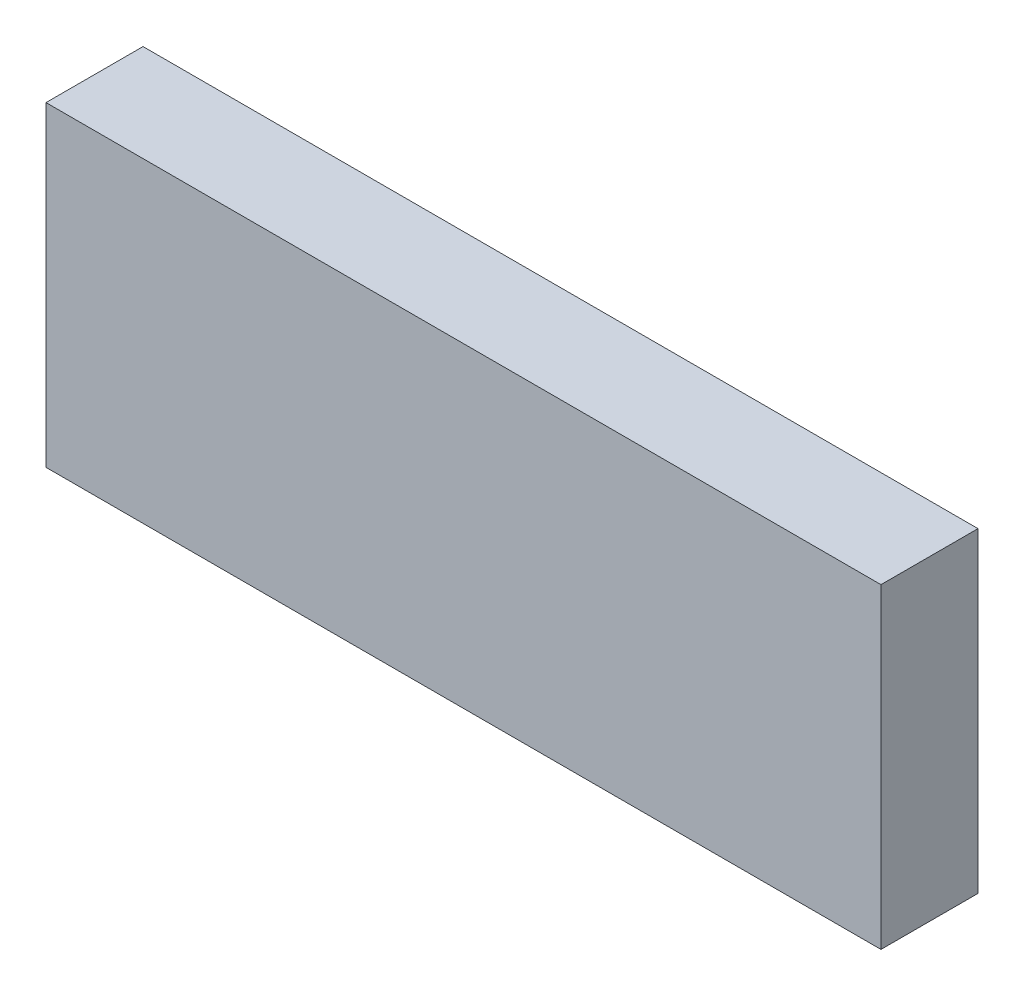
ISO-10303-21;
HEADER;
FILE_DESCRIPTION(('STEP AP214'),'2;1');
FILE_NAME('part.step','',(''),(''),'','','');
FILE_SCHEMA(('AUTOMOTIVE_DESIGN { 1 0 10303 214 1 1 1 1 }'));
ENDSEC;
DATA;
#1=APPLICATION_CONTEXT('core data for automotive mechanical design processes');
#2=APPLICATION_PROTOCOL_DEFINITION('international standard','automotive_design',2000,#1);
#3=PRODUCT_CONTEXT('',#1,'mechanical');
#4=PRODUCT('Part','Part','',(#3));
#5=PRODUCT_RELATED_PRODUCT_CATEGORY('part','',(#4));
#6=PRODUCT_DEFINITION_FORMATION('','',#4);
#7=PRODUCT_DEFINITION_CONTEXT('part definition',#1,'design');
#8=PRODUCT_DEFINITION('design','',#6,#7);
#9=PRODUCT_DEFINITION_SHAPE('','',#8);
#10=(LENGTH_UNIT() NAMED_UNIT(*) SI_UNIT(.MILLI.,.METRE.));
#11=(NAMED_UNIT(*) PLANE_ANGLE_UNIT() SI_UNIT($,.RADIAN.));
#12=(NAMED_UNIT(*) SI_UNIT($,.STERADIAN.) SOLID_ANGLE_UNIT());
#13=UNCERTAINTY_MEASURE_WITH_UNIT(LENGTH_MEASURE(1.E-05),#10,'distance_accuracy_value','');
#14=(GEOMETRIC_REPRESENTATION_CONTEXT(3) GLOBAL_UNCERTAINTY_ASSIGNED_CONTEXT((#13)) GLOBAL_UNIT_ASSIGNED_CONTEXT((#10,
#11,#12)) REPRESENTATION_CONTEXT('',''));
#15=CARTESIAN_POINT('',(0.,0.,0.));
#16=DIRECTION('',(0.,0.,1.));
#17=DIRECTION('',(1.,0.,0.));
#18=AXIS2_PLACEMENT_3D('',#15,#16,#17);
#19=CARTESIAN_POINT('',(274.3,210.5,-9.81386968283));
#20=DIRECTION('',(0.,0.,1.));
#21=DIRECTION('',(-1.,0.,0.));
#22=AXIS2_PLACEMENT_3D('',#19,#20,#21);
#23=PLANE('',#22);
#24=DIRECTION('',(0.,1.,0.));
#25=VECTOR('',#24,1.);
#26=CARTESIAN_POINT('',(255.8,217.5,-9.81386968283));
#27=LINE('',#26,#25);
#28=CARTESIAN_POINT('',(255.8,203.5,-9.81386968283));
#29=VERTEX_POINT('',#28);
#30=CARTESIAN_POINT('',(255.8,217.5,-9.81386968283));
#31=VERTEX_POINT('',#30);
#32=EDGE_CURVE('E97',#29,#31,#27,.T.);
#33=ORIENTED_EDGE('',*,*,#32,.F.);
#34=DIRECTION('',(-1.,0.,0.));
#35=VECTOR('',#34,1.);
#36=CARTESIAN_POINT('',(255.8,203.5,-9.81386968283));
#37=LINE('',#36,#35);
#38=CARTESIAN_POINT('',(292.8,203.5,-9.81386968283));
#39=VERTEX_POINT('',#38);
#40=EDGE_CURVE('E11',#39,#29,#37,.T.);
#41=ORIENTED_EDGE('',*,*,#40,.F.);
#42=DIRECTION('',(0.,-1.,0.));
#43=VECTOR('',#42,1.);
#44=CARTESIAN_POINT('',(292.8,203.5,-9.81386968283));
#45=LINE('',#44,#43);
#46=CARTESIAN_POINT('',(292.8,217.5,-9.81386968283));
#47=VERTEX_POINT('',#46);
#48=EDGE_CURVE('E56',#47,#39,#45,.T.);
#49=ORIENTED_EDGE('',*,*,#48,.F.);
#50=DIRECTION('',(1.,0.,0.));
#51=VECTOR('',#50,1.);
#52=CARTESIAN_POINT('',(292.8,217.5,-9.81386968283));
#53=LINE('',#52,#51);
#54=EDGE_CURVE('E96',#31,#47,#53,.T.);
#55=ORIENTED_EDGE('',*,*,#54,.F.);
#56=EDGE_LOOP('',(#33,#41,#49,#55));
#57=FACE_BOUND('',#56,.T.);
#58=ADVANCED_FACE('F49',(#57),#23,.T.);
#59=CARTESIAN_POINT('',(255.8,203.5,-14.11386968283));
#60=DIRECTION('',(0.,-1.,0.));
#61=DIRECTION('',(-1.,0.,0.));
#62=AXIS2_PLACEMENT_3D('',#59,#60,#61);
#63=PLANE('',#62);
#64=DIRECTION('',(0.,0.,1.));
#65=VECTOR('',#64,1.);
#66=CARTESIAN_POINT('',(255.8,203.5,-14.11386968283));
#67=LINE('',#66,#65);
#68=CARTESIAN_POINT('',(255.8,203.5,-14.11386968283));
#69=VERTEX_POINT('',#68);
#70=EDGE_CURVE('E115',#69,#29,#67,.T.);
#71=ORIENTED_EDGE('',*,*,#70,.F.);
#72=DIRECTION('',(1.,0.,0.));
#73=VECTOR('',#72,1.);
#74=CARTESIAN_POINT('',(274.3,203.5,-14.11386968283));
#75=LINE('',#74,#73);
#76=CARTESIAN_POINT('',(292.8,203.5,-14.11386968283));
#77=VERTEX_POINT('',#76);
#78=EDGE_CURVE('E126',#69,#77,#75,.T.);
#79=ORIENTED_EDGE('',*,*,#78,.T.);
#80=DIRECTION('',(0.,0.,-1.));
#81=VECTOR('',#80,1.);
#82=CARTESIAN_POINT('',(292.8,203.5,-14.11386968283));
#83=LINE('',#82,#81);
#84=EDGE_CURVE('E52',#39,#77,#83,.T.);
#85=ORIENTED_EDGE('',*,*,#84,.F.);
#86=ORIENTED_EDGE('',*,*,#40,.T.);
#87=EDGE_LOOP('',(#71,#79,#85,#86));
#88=FACE_BOUND('',#87,.T.);
#89=ADVANCED_FACE('F156',(#88),#63,.T.);
#90=CARTESIAN_POINT('',(292.8,203.5,-14.11386968283));
#91=DIRECTION('',(1.,0.,0.));
#92=DIRECTION('',(0.,0.,1.));
#93=AXIS2_PLACEMENT_3D('',#90,#91,#92);
#94=PLANE('',#93);
#95=ORIENTED_EDGE('',*,*,#84,.T.);
#96=DIRECTION('',(0.,1.,0.));
#97=VECTOR('',#96,1.);
#98=CARTESIAN_POINT('',(292.8,210.5,-14.11386968283));
#99=LINE('',#98,#97);
#100=CARTESIAN_POINT('',(292.8,217.5,-14.11386968283));
#101=VERTEX_POINT('',#100);
#102=EDGE_CURVE('E139',#77,#101,#99,.T.);
#103=ORIENTED_EDGE('',*,*,#102,.T.);
#104=DIRECTION('',(0.,0.,-1.));
#105=VECTOR('',#104,1.);
#106=CARTESIAN_POINT('',(292.8,217.5,-14.11386968283));
#107=LINE('',#106,#105);
#108=EDGE_CURVE('E103',#47,#101,#107,.T.);
#109=ORIENTED_EDGE('',*,*,#108,.F.);
#110=ORIENTED_EDGE('',*,*,#48,.T.);
#111=EDGE_LOOP('',(#95,#103,#109,#110));
#112=FACE_BOUND('',#111,.T.);
#113=ADVANCED_FACE('F141',(#112),#94,.T.);
#114=CARTESIAN_POINT('',(292.8,217.5,-14.11386968283));
#115=DIRECTION('',(0.,1.,0.));
#116=DIRECTION('',(0.,0.,-1.));
#117=AXIS2_PLACEMENT_3D('',#114,#115,#116);
#118=PLANE('',#117);
#119=ORIENTED_EDGE('',*,*,#108,.T.);
#120=DIRECTION('',(-1.,0.,0.));
#121=VECTOR('',#120,1.);
#122=CARTESIAN_POINT('',(274.3,217.5,-14.11386968283));
#123=LINE('',#122,#121);
#124=CARTESIAN_POINT('',(255.8,217.5,-14.11386968283));
#125=VERTEX_POINT('',#124);
#126=EDGE_CURVE('E118',#101,#125,#123,.T.);
#127=ORIENTED_EDGE('',*,*,#126,.T.);
#128=DIRECTION('',(0.,0.,-1.));
#129=VECTOR('',#128,1.);
#130=CARTESIAN_POINT('',(255.8,217.5,-14.11386968283));
#131=LINE('',#130,#129);
#132=EDGE_CURVE('E106',#31,#125,#131,.T.);
#133=ORIENTED_EDGE('',*,*,#132,.F.);
#134=ORIENTED_EDGE('',*,*,#54,.T.);
#135=EDGE_LOOP('',(#119,#127,#133,#134));
#136=FACE_BOUND('',#135,.T.);
#137=ADVANCED_FACE('F117',(#136),#118,.T.);
#138=CARTESIAN_POINT('',(255.8,217.5,-14.11386968283));
#139=DIRECTION('',(-1.,0.,0.));
#140=DIRECTION('',(0.,-1.,0.));
#141=AXIS2_PLACEMENT_3D('',#138,#139,#140);
#142=PLANE('',#141);
#143=ORIENTED_EDGE('',*,*,#132,.T.);
#144=DIRECTION('',(0.,-1.,0.));
#145=VECTOR('',#144,1.);
#146=CARTESIAN_POINT('',(255.8,210.5,-14.11386968283));
#147=LINE('',#146,#145);
#148=EDGE_CURVE('E116',#125,#69,#147,.T.);
#149=ORIENTED_EDGE('',*,*,#148,.T.);
#150=ORIENTED_EDGE('',*,*,#70,.T.);
#151=ORIENTED_EDGE('',*,*,#32,.T.);
#152=EDGE_LOOP('',(#143,#149,#150,#151));
#153=FACE_BOUND('',#152,.T.);
#154=ADVANCED_FACE('F108',(#153),#142,.T.);
#155=CARTESIAN_POINT('',(274.3,210.5,-14.11386968283));
#156=DIRECTION('',(0.,0.,1.));
#157=DIRECTION('',(-1.,0.,0.));
#158=AXIS2_PLACEMENT_3D('',#155,#156,#157);
#159=PLANE('',#158);
#160=ORIENTED_EDGE('',*,*,#126,.F.);
#161=ORIENTED_EDGE('',*,*,#102,.F.);
#162=ORIENTED_EDGE('',*,*,#78,.F.);
#163=ORIENTED_EDGE('',*,*,#148,.F.);
#164=EDGE_LOOP('',(#160,#161,#162,#163));
#165=FACE_BOUND('',#164,.T.);
#166=ADVANCED_FACE('F149',(#165),#159,.F.);
#167=CLOSED_SHELL('',(#58,#89,#113,#137,#154,#166));
#168=MANIFOLD_SOLID_BREP('B2',#167);
#169=ADVANCED_BREP_SHAPE_REPRESENTATION('',(#18,#168),#14);
#170=SHAPE_DEFINITION_REPRESENTATION(#9,#169);
ENDSEC;
END-ISO-10303-21;
